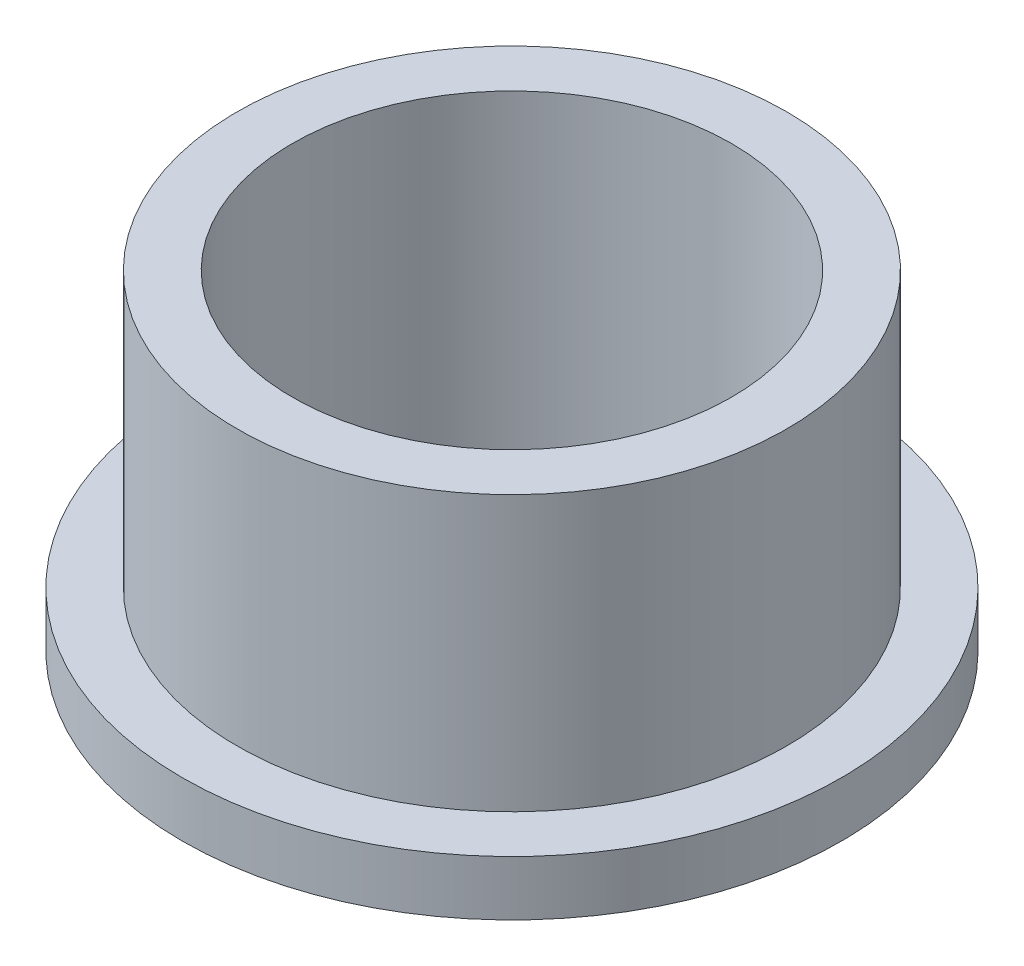
ISO-10303-21;
HEADER;
FILE_DESCRIPTION(('STEP AP214'),'2;1');
FILE_NAME('part.step','',(''),(''),'','','');
FILE_SCHEMA(('AUTOMOTIVE_DESIGN { 1 0 10303 214 1 1 1 1 }'));
ENDSEC;
DATA;
#1=APPLICATION_CONTEXT('core data for automotive mechanical design processes');
#2=APPLICATION_PROTOCOL_DEFINITION('international standard','automotive_design',2000,#1);
#3=PRODUCT_CONTEXT('',#1,'mechanical');
#4=PRODUCT('Part','Part','',(#3));
#5=PRODUCT_RELATED_PRODUCT_CATEGORY('part','',(#4));
#6=PRODUCT_DEFINITION_FORMATION('','',#4);
#7=PRODUCT_DEFINITION_CONTEXT('part definition',#1,'design');
#8=PRODUCT_DEFINITION('design','',#6,#7);
#9=PRODUCT_DEFINITION_SHAPE('','',#8);
#10=(LENGTH_UNIT() NAMED_UNIT(*) SI_UNIT(.MILLI.,.METRE.));
#11=(NAMED_UNIT(*) PLANE_ANGLE_UNIT() SI_UNIT($,.RADIAN.));
#12=(NAMED_UNIT(*) SI_UNIT($,.STERADIAN.) SOLID_ANGLE_UNIT());
#13=UNCERTAINTY_MEASURE_WITH_UNIT(LENGTH_MEASURE(1.E-05),#10,'distance_accuracy_value','');
#14=(GEOMETRIC_REPRESENTATION_CONTEXT(3) GLOBAL_UNCERTAINTY_ASSIGNED_CONTEXT((#13)) GLOBAL_UNIT_ASSIGNED_CONTEXT((#10,
#11,#12)) REPRESENTATION_CONTEXT('',''));
#15=CARTESIAN_POINT('',(0.,0.,0.));
#16=DIRECTION('',(0.,0.,1.));
#17=DIRECTION('',(1.,0.,0.));
#18=AXIS2_PLACEMENT_3D('',#15,#16,#17);
#19=CARTESIAN_POINT('',(0.,19.05,0.));
#20=DIRECTION('',(0.,1.,0.));
#21=DIRECTION('',(0.,0.,1.));
#22=AXIS2_PLACEMENT_3D('',#19,#20,#21);
#23=PLANE('',#22);
#24=CARTESIAN_POINT('',(0.,19.05,0.));
#25=DIRECTION('',(0.,1.,0.));
#26=DIRECTION('',(0.,0.,1.));
#27=AXIS2_PLACEMENT_3D('',#24,#25,#26);
#28=CIRCLE('',#27,15.88135);
#29=CARTESIAN_POINT('',(0.,19.05,-15.88135));
#30=VERTEX_POINT('',#29);
#31=EDGE_CURVE('E10',#30,#30,#28,.T.);
#32=ORIENTED_EDGE('',*,*,#31,.T.);
#33=EDGE_LOOP('',(#32));
#34=FACE_BOUND('',#33,.T.);
#35=CARTESIAN_POINT('',(0.,19.05,0.));
#36=DIRECTION('',(0.,1.,0.));
#37=DIRECTION('',(0.,0.,1.));
#38=AXIS2_PLACEMENT_3D('',#35,#36,#37);
#39=CIRCLE('',#38,12.7);
#40=CARTESIAN_POINT('',(0.,19.05,-12.7));
#41=VERTEX_POINT('',#40);
#42=EDGE_CURVE('E37',#41,#41,#39,.T.);
#43=ORIENTED_EDGE('',*,*,#42,.F.);
#44=EDGE_LOOP('',(#43));
#45=FACE_BOUND('',#44,.T.);
#46=ADVANCED_FACE('F30',(#34,#45),#23,.T.);
#47=CARTESIAN_POINT('',(0.,0.,0.));
#48=DIRECTION('',(0.,1.,0.));
#49=DIRECTION('',(0.,0.,1.));
#50=AXIS2_PLACEMENT_3D('',#47,#48,#49);
#51=PLANE('',#50);
#52=CARTESIAN_POINT('',(0.,0.,0.));
#53=DIRECTION('',(0.,1.,0.));
#54=DIRECTION('',(0.,0.,1.));
#55=AXIS2_PLACEMENT_3D('',#52,#53,#54);
#56=CIRCLE('',#55,12.7);
#57=CARTESIAN_POINT('',(0.,0.,-12.7));
#58=VERTEX_POINT('',#57);
#59=EDGE_CURVE('E41',#58,#58,#56,.T.);
#60=ORIENTED_EDGE('',*,*,#59,.T.);
#61=EDGE_LOOP('',(#60));
#62=FACE_BOUND('',#61,.T.);
#63=CARTESIAN_POINT('',(0.,0.,0.));
#64=DIRECTION('',(0.,1.,0.));
#65=DIRECTION('',(0.,0.,1.));
#66=AXIS2_PLACEMENT_3D('',#63,#64,#65);
#67=CIRCLE('',#66,19.05);
#68=CARTESIAN_POINT('',(0.,0.,19.05));
#69=VERTEX_POINT('',#68);
#70=EDGE_CURVE('E48',#69,#69,#67,.T.);
#71=ORIENTED_EDGE('',*,*,#70,.F.);
#72=EDGE_LOOP('',(#71));
#73=FACE_BOUND('',#72,.T.);
#74=ADVANCED_FACE('F73',(#62,#73),#51,.F.);
#75=CARTESIAN_POINT('',(0.,19.05,0.));
#76=DIRECTION('',(0.,-1.,0.));
#77=DIRECTION('',(0.,0.,-1.));
#78=AXIS2_PLACEMENT_3D('',#75,#76,#77);
#79=CYLINDRICAL_SURFACE('',#78,15.88135);
#80=CARTESIAN_POINT('',(0.,3.175,0.));
#81=DIRECTION('',(0.,1.,0.));
#82=DIRECTION('',(0.,0.,1.));
#83=AXIS2_PLACEMENT_3D('',#80,#81,#82);
#84=CIRCLE('',#83,15.88135);
#85=CARTESIAN_POINT('',(0.,3.175,-15.88135));
#86=VERTEX_POINT('',#85);
#87=EDGE_CURVE('E51',#86,#86,#84,.T.);
#88=CARTESIAN_POINT('',(0.,3.175,-15.88135));
#89=CARTESIAN_POINT('',(0.,3.34036458333333,-15.88135));
#90=CARTESIAN_POINT('',(0.,3.50572916666666,-15.88135));
#91=CARTESIAN_POINT('',(0.,3.83645833333333,-15.88135));
#92=CARTESIAN_POINT('',(0.,4.00182291666666,-15.88135));
#93=CARTESIAN_POINT('',(0.,4.33255208333333,-15.88135));
#94=CARTESIAN_POINT('',(0.,4.49791666666666,-15.88135));
#95=CARTESIAN_POINT('',(0.,4.82864583333333,-15.88135));
#96=CARTESIAN_POINT('',(0.,4.99401041666666,-15.88135));
#97=CARTESIAN_POINT('',(0.,5.32473958333333,-15.88135));
#98=CARTESIAN_POINT('',(0.,5.49010416666666,-15.88135));
#99=CARTESIAN_POINT('',(0.,5.82083333333333,-15.88135));
#100=CARTESIAN_POINT('',(0.,5.98619791666666,-15.88135));
#101=CARTESIAN_POINT('',(0.,6.31692708333333,-15.88135));
#102=CARTESIAN_POINT('',(0.,6.48229166666666,-15.88135));
#103=CARTESIAN_POINT('',(0.,6.81302083333333,-15.88135));
#104=CARTESIAN_POINT('',(0.,6.97838541666666,-15.88135));
#105=CARTESIAN_POINT('',(0.,7.30911458333333,-15.88135));
#106=CARTESIAN_POINT('',(0.,7.47447916666667,-15.88135));
#107=CARTESIAN_POINT('',(0.,7.80520833333333,-15.88135));
#108=CARTESIAN_POINT('',(0.,7.97057291666667,-15.88135));
#109=CARTESIAN_POINT('',(0.,8.30130208333333,-15.88135));
#110=CARTESIAN_POINT('',(0.,8.46666666666666,-15.88135));
#111=CARTESIAN_POINT('',(0.,8.79739583333333,-15.88135));
#112=CARTESIAN_POINT('',(0.,8.96276041666667,-15.88135));
#113=CARTESIAN_POINT('',(0.,9.29348958333333,-15.88135));
#114=CARTESIAN_POINT('',(0.,9.45885416666667,-15.88135));
#115=CARTESIAN_POINT('',(0.,9.78958333333333,-15.88135));
#116=CARTESIAN_POINT('',(0.,9.95494791666667,-15.88135));
#117=CARTESIAN_POINT('',(0.,10.2856770833333,-15.88135));
#118=CARTESIAN_POINT('',(0.,10.4510416666667,-15.88135));
#119=CARTESIAN_POINT('',(0.,10.7817708333333,-15.88135));
#120=CARTESIAN_POINT('',(0.,10.9471354166667,-15.88135));
#121=CARTESIAN_POINT('',(0.,11.2778645833333,-15.88135));
#122=CARTESIAN_POINT('',(0.,11.4432291666667,-15.88135));
#123=CARTESIAN_POINT('',(0.,11.7739583333333,-15.88135));
#124=CARTESIAN_POINT('',(0.,11.9393229166667,-15.88135));
#125=CARTESIAN_POINT('',(0.,12.2700520833333,-15.88135));
#126=CARTESIAN_POINT('',(0.,12.4354166666667,-15.88135));
#127=CARTESIAN_POINT('',(0.,12.7661458333333,-15.88135));
#128=CARTESIAN_POINT('',(0.,12.9315104166667,-15.88135));
#129=CARTESIAN_POINT('',(0.,13.2622395833333,-15.88135));
#130=CARTESIAN_POINT('',(0.,13.4276041666667,-15.88135));
#131=CARTESIAN_POINT('',(0.,13.7583333333333,-15.88135));
#132=CARTESIAN_POINT('',(0.,13.9236979166667,-15.88135));
#133=CARTESIAN_POINT('',(0.,14.2544270833333,-15.88135));
#134=CARTESIAN_POINT('',(0.,14.4197916666667,-15.88135));
#135=CARTESIAN_POINT('',(0.,14.7505208333333,-15.88135));
#136=CARTESIAN_POINT('',(0.,14.9158854166667,-15.88135));
#137=CARTESIAN_POINT('',(0.,15.2466145833333,-15.88135));
#138=CARTESIAN_POINT('',(0.,15.4119791666667,-15.88135));
#139=CARTESIAN_POINT('',(0.,15.7427083333333,-15.88135));
#140=CARTESIAN_POINT('',(0.,15.9080729166667,-15.88135));
#141=CARTESIAN_POINT('',(0.,16.2388020833333,-15.88135));
#142=CARTESIAN_POINT('',(0.,16.4041666666667,-15.88135));
#143=CARTESIAN_POINT('',(0.,16.7348958333333,-15.88135));
#144=CARTESIAN_POINT('',(0.,16.9002604166667,-15.88135));
#145=CARTESIAN_POINT('',(0.,17.2309895833333,-15.88135));
#146=CARTESIAN_POINT('',(0.,17.3963541666667,-15.88135));
#147=CARTESIAN_POINT('',(0.,17.7270833333333,-15.88135));
#148=CARTESIAN_POINT('',(0.,17.8924479166667,-15.88135));
#149=CARTESIAN_POINT('',(0.,18.2231770833333,-15.88135));
#150=CARTESIAN_POINT('',(0.,18.3885416666667,-15.88135));
#151=CARTESIAN_POINT('',(0.,18.7192708333333,-15.88135));
#152=CARTESIAN_POINT('',(0.,18.8846354166667,-15.88135));
#153=CARTESIAN_POINT('',(0.,19.05,-15.88135));
#154=B_SPLINE_CURVE_WITH_KNOTS('',3,(#88,#89,#90,#91,#92,#93,#94,#95,#96,#97,#98,#99,#100,#101,
#102,#103,#104,#105,#106,#107,#108,#109,#110,#111,#112,#113,#114,#115,#116,#117,#118,#119,#120,
#121,#122,#123,#124,#125,#126,#127,#128,#129,#130,#131,#132,#133,#134,#135,#136,#137,#138,#139,
#140,#141,#142,#143,#144,#145,#146,#147,#148,#149,#150,#151,#152,#153),.UNSPECIFIED.,.F.,.F.,(4,
2,2,2,2,2,2,2,2,2,2,2,2,2,2,2,2,2,2,2,2,2,2,2,2,2,2,2,2,2,2,2,4),(0.,0.496093749999999,
0.992187499999998,1.48828125,1.984375,2.48046875,2.9765625,3.47265625,3.96875,4.46484375,
4.9609375,5.45703125,5.953125,6.44921875,6.9453125,7.44140625,7.9375,8.43359375,8.9296875,
9.42578125,9.921875,10.41796875,10.9140625,11.41015625,11.90625,12.40234375,12.8984375,
13.39453125,13.890625,14.38671875,14.8828125,15.37890625,15.875),.UNSPECIFIED.);
#155=EDGE_CURVE('BSEAM32',#86,#30,#154,.T.);
#156=ORIENTED_EDGE('',*,*,#87,.T.);
#157=ORIENTED_EDGE('',*,*,#31,.F.);
#158=ORIENTED_EDGE('',*,*,#155,.T.);
#159=ORIENTED_EDGE('',*,*,#155,.F.);
#160=EDGE_LOOP('',(#156,#158,#157,#159));
#161=FACE_BOUND('',#160,.T.);
#162=ADVANCED_FACE('F32',(#161),#79,.T.);
#163=CARTESIAN_POINT('',(0.,19.05,0.));
#164=DIRECTION('',(0.,-1.,0.));
#165=DIRECTION('',(0.,0.,-1.));
#166=AXIS2_PLACEMENT_3D('',#163,#164,#165);
#167=CYLINDRICAL_SURFACE('',#166,12.7);
#168=CARTESIAN_POINT('',(0.,19.05,-12.7));
#169=CARTESIAN_POINT('',(0.,18.8515625,-12.7));
#170=CARTESIAN_POINT('',(0.,18.653125,-12.7));
#171=CARTESIAN_POINT('',(0.,18.25625,-12.7));
#172=CARTESIAN_POINT('',(0.,18.0578125,-12.7));
#173=CARTESIAN_POINT('',(0.,17.6609375,-12.7));
#174=CARTESIAN_POINT('',(0.,17.4625,-12.7));
#175=CARTESIAN_POINT('',(0.,17.065625,-12.7));
#176=CARTESIAN_POINT('',(0.,16.8671875,-12.7));
#177=CARTESIAN_POINT('',(0.,16.4703125,-12.7));
#178=CARTESIAN_POINT('',(0.,16.271875,-12.7));
#179=CARTESIAN_POINT('',(0.,15.875,-12.7));
#180=CARTESIAN_POINT('',(0.,15.6765625,-12.7));
#181=CARTESIAN_POINT('',(0.,15.2796875,-12.7));
#182=CARTESIAN_POINT('',(0.,15.08125,-12.7));
#183=CARTESIAN_POINT('',(0.,14.684375,-12.7));
#184=CARTESIAN_POINT('',(0.,14.4859375,-12.7));
#185=CARTESIAN_POINT('',(0.,14.0890625,-12.7));
#186=CARTESIAN_POINT('',(0.,13.890625,-12.7));
#187=CARTESIAN_POINT('',(0.,13.49375,-12.7));
#188=CARTESIAN_POINT('',(0.,13.2953125,-12.7));
#189=CARTESIAN_POINT('',(0.,12.8984375,-12.7));
#190=CARTESIAN_POINT('',(0.,12.7,-12.7));
#191=CARTESIAN_POINT('',(0.,12.303125,-12.7));
#192=CARTESIAN_POINT('',(0.,12.1046875,-12.7));
#193=CARTESIAN_POINT('',(0.,11.7078125,-12.7));
#194=CARTESIAN_POINT('',(0.,11.509375,-12.7));
#195=CARTESIAN_POINT('',(0.,11.1125,-12.7));
#196=CARTESIAN_POINT('',(0.,10.9140625,-12.7));
#197=CARTESIAN_POINT('',(0.,10.5171875,-12.7));
#198=CARTESIAN_POINT('',(0.,10.31875,-12.7));
#199=CARTESIAN_POINT('',(0.,9.921875,-12.7));
#200=CARTESIAN_POINT('',(0.,9.7234375,-12.7));
#201=CARTESIAN_POINT('',(0.,9.3265625,-12.7));
#202=CARTESIAN_POINT('',(0.,9.128125,-12.7));
#203=CARTESIAN_POINT('',(0.,8.73125,-12.7));
#204=CARTESIAN_POINT('',(0.,8.5328125,-12.7));
#205=CARTESIAN_POINT('',(0.,8.1359375,-12.7));
#206=CARTESIAN_POINT('',(0.,7.9375,-12.7));
#207=CARTESIAN_POINT('',(0.,7.540625,-12.7));
#208=CARTESIAN_POINT('',(0.,7.3421875,-12.7));
#209=CARTESIAN_POINT('',(0.,6.9453125,-12.7));
#210=CARTESIAN_POINT('',(0.,6.746875,-12.7));
#211=CARTESIAN_POINT('',(0.,6.35,-12.7));
#212=CARTESIAN_POINT('',(0.,6.1515625,-12.7));
#213=CARTESIAN_POINT('',(0.,5.7546875,-12.7));
#214=CARTESIAN_POINT('',(0.,5.55625,-12.7));
#215=CARTESIAN_POINT('',(0.,5.159375,-12.7));
#216=CARTESIAN_POINT('',(0.,4.9609375,-12.7));
#217=CARTESIAN_POINT('',(0.,4.5640625,-12.7));
#218=CARTESIAN_POINT('',(0.,4.365625,-12.7));
#219=CARTESIAN_POINT('',(0.,3.96875,-12.7));
#220=CARTESIAN_POINT('',(0.,3.7703125,-12.7));
#221=CARTESIAN_POINT('',(0.,3.3734375,-12.7));
#222=CARTESIAN_POINT('',(0.,3.175,-12.7));
#223=CARTESIAN_POINT('',(0.,2.778125,-12.7));
#224=CARTESIAN_POINT('',(0.,2.5796875,-12.7));
#225=CARTESIAN_POINT('',(0.,2.1828125,-12.7));
#226=CARTESIAN_POINT('',(0.,1.984375,-12.7));
#227=CARTESIAN_POINT('',(0.,1.5875,-12.7));
#228=CARTESIAN_POINT('',(0.,1.3890625,-12.7));
#229=CARTESIAN_POINT('',(0.,0.992187500000001,-12.7));
#230=CARTESIAN_POINT('',(0.,0.793750000000001,-12.7));
#231=CARTESIAN_POINT('',(0.,0.396875,-12.7));
#232=CARTESIAN_POINT('',(0.,0.1984375,-12.7));
#233=CARTESIAN_POINT('',(0.,0.,-12.7));
#234=B_SPLINE_CURVE_WITH_KNOTS('',3,(#168,#169,#170,#171,#172,#173,#174,#175,#176,#177,#178,
#179,#180,#181,#182,#183,#184,#185,#186,#187,#188,#189,#190,#191,#192,#193,#194,#195,#196,#197,
#198,#199,#200,#201,#202,#203,#204,#205,#206,#207,#208,#209,#210,#211,#212,#213,#214,#215,#216,
#217,#218,#219,#220,#221,#222,#223,#224,#225,#226,#227,#228,#229,#230,#231,#232,#233),
.UNSPECIFIED.,.F.,.F.,(4,2,2,2,2,2,2,2,2,2,2,2,2,2,2,2,2,2,2,2,2,2,2,2,2,2,2,2,2,2,2,2,4),(0.,
0.595312499999997,1.190625,1.7859375,2.38125,2.9765625,3.571875,4.1671875,4.7625,5.3578125,
5.953125,6.5484375,7.14375,7.7390625,8.334375,8.9296875,9.525,10.1203125,10.715625,11.3109375,
11.90625,12.5015625,13.096875,13.6921875,14.2875,14.8828125,15.478125,16.0734375,16.66875,
17.2640625,17.859375,18.4546875,19.05),.UNSPECIFIED.);
#235=EDGE_CURVE('BSEAM62',#41,#58,#234,.T.);
#236=ORIENTED_EDGE('',*,*,#42,.T.);
#237=ORIENTED_EDGE('',*,*,#59,.F.);
#238=ORIENTED_EDGE('',*,*,#235,.T.);
#239=ORIENTED_EDGE('',*,*,#235,.F.);
#240=EDGE_LOOP('',(#236,#238,#237,#239));
#241=FACE_BOUND('',#240,.T.);
#242=ADVANCED_FACE('F62',(#241),#167,.F.);
#243=CARTESIAN_POINT('',(0.,3.175,0.));
#244=DIRECTION('',(0.,1.,0.));
#245=DIRECTION('',(0.,0.,1.));
#246=AXIS2_PLACEMENT_3D('',#243,#244,#245);
#247=PLANE('',#246);
#248=CARTESIAN_POINT('',(0.,3.175,0.));
#249=DIRECTION('',(0.,1.,0.));
#250=DIRECTION('',(0.,0.,1.));
#251=AXIS2_PLACEMENT_3D('',#248,#249,#250);
#252=CIRCLE('',#251,19.05);
#253=CARTESIAN_POINT('',(0.,3.175,19.05));
#254=VERTEX_POINT('',#253);
#255=EDGE_CURVE('E46',#254,#254,#252,.T.);
#256=ORIENTED_EDGE('',*,*,#255,.T.);
#257=EDGE_LOOP('',(#256));
#258=FACE_BOUND('',#257,.T.);
#259=ORIENTED_EDGE('',*,*,#87,.F.);
#260=EDGE_LOOP('',(#259));
#261=FACE_BOUND('',#260,.T.);
#262=ADVANCED_FACE('F59',(#258,#261),#247,.T.);
#263=CARTESIAN_POINT('',(0.,3.175,0.));
#264=DIRECTION('',(0.,-1.,0.));
#265=DIRECTION('',(0.,0.,-1.));
#266=AXIS2_PLACEMENT_3D('',#263,#264,#265);
#267=CYLINDRICAL_SURFACE('',#266,19.05);
#268=ORIENTED_EDGE('',*,*,#255,.F.);
#269=EDGE_LOOP('',(#268));
#270=FACE_BOUND('',#269,.T.);
#271=ORIENTED_EDGE('',*,*,#70,.T.);
#272=EDGE_LOOP('',(#271));
#273=FACE_BOUND('',#272,.T.);
#274=ADVANCED_FACE('F61',(#270,#273),#267,.T.);
#275=CLOSED_SHELL('',(#46,#74,#162,#242,#262,#274));
#276=MANIFOLD_SOLID_BREP('B2',#275);
#277=ADVANCED_BREP_SHAPE_REPRESENTATION('',(#18,#276),#14);
#278=SHAPE_DEFINITION_REPRESENTATION(#9,#277);
ENDSEC;
END-ISO-10303-21;
